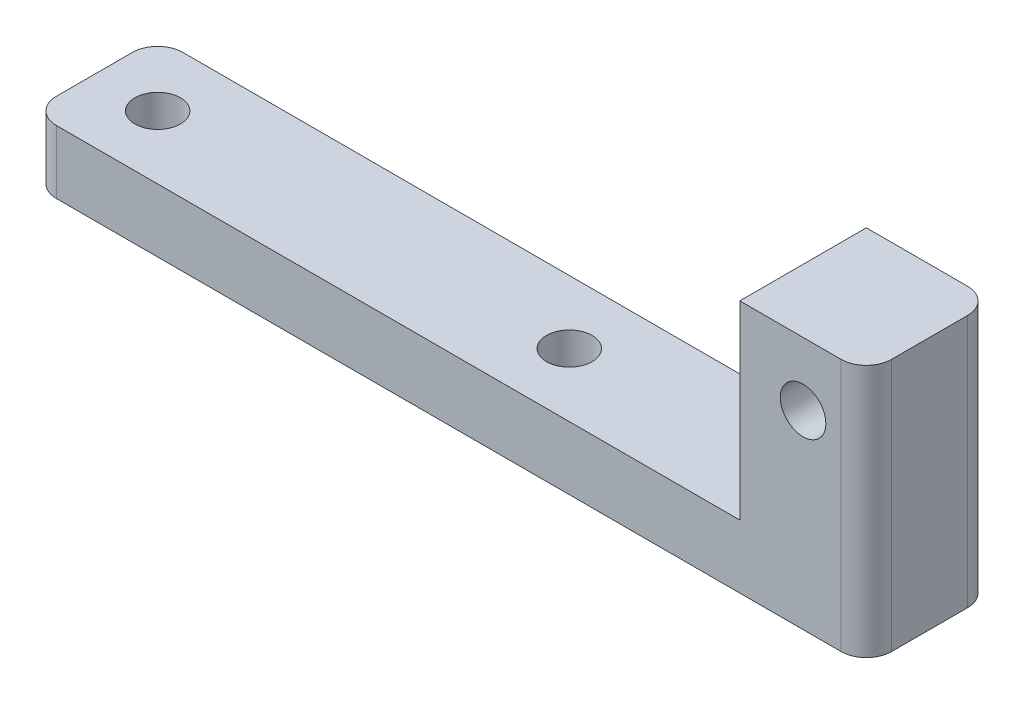
ISO-10303-21;
HEADER;
FILE_DESCRIPTION(('STEP AP214'),'2;1');
FILE_NAME('part.step','',(''),(''),'','','');
FILE_SCHEMA(('AUTOMOTIVE_DESIGN { 1 0 10303 214 1 1 1 1 }'));
ENDSEC;
DATA;
#1=APPLICATION_CONTEXT('core data for automotive mechanical design processes');
#2=APPLICATION_PROTOCOL_DEFINITION('international standard','automotive_design',2000,#1);
#3=PRODUCT_CONTEXT('',#1,'mechanical');
#4=PRODUCT('Part','Part','',(#3));
#5=PRODUCT_RELATED_PRODUCT_CATEGORY('part','',(#4));
#6=PRODUCT_DEFINITION_FORMATION('','',#4);
#7=PRODUCT_DEFINITION_CONTEXT('part definition',#1,'design');
#8=PRODUCT_DEFINITION('design','',#6,#7);
#9=PRODUCT_DEFINITION_SHAPE('','',#8);
#10=(LENGTH_UNIT() NAMED_UNIT(*) SI_UNIT(.MILLI.,.METRE.));
#11=(NAMED_UNIT(*) PLANE_ANGLE_UNIT() SI_UNIT($,.RADIAN.));
#12=(NAMED_UNIT(*) SI_UNIT($,.STERADIAN.) SOLID_ANGLE_UNIT());
#13=UNCERTAINTY_MEASURE_WITH_UNIT(LENGTH_MEASURE(1.E-05),#10,'distance_accuracy_value','');
#14=(GEOMETRIC_REPRESENTATION_CONTEXT(3) GLOBAL_UNCERTAINTY_ASSIGNED_CONTEXT((#13)) GLOBAL_UNIT_ASSIGNED_CONTEXT((#10,
#11,#12)) REPRESENTATION_CONTEXT('',''));
#15=CARTESIAN_POINT('',(0.,0.,0.));
#16=DIRECTION('',(0.,0.,1.));
#17=DIRECTION('',(1.,0.,0.));
#18=AXIS2_PLACEMENT_3D('',#15,#16,#17);
#19=CARTESIAN_POINT('',(0.,25.4,0.));
#20=DIRECTION('',(0.,-1.,0.));
#21=DIRECTION('',(0.,0.,-1.));
#22=AXIS2_PLACEMENT_3D('',#19,#20,#21);
#23=PLANE('',#22);
#24=DIRECTION('',(-1.,0.,0.));
#25=VECTOR('',#24,1.);
#26=CARTESIAN_POINT('',(0.,25.4,-12.7));
#27=LINE('',#26,#25);
#28=CARTESIAN_POINT('',(81.28,25.4,-12.7));
#29=VERTEX_POINT('',#28);
#30=CARTESIAN_POINT('',(71.12,25.4,-12.7));
#31=VERTEX_POINT('',#30);
#32=EDGE_CURVE('E192',#29,#31,#27,.T.);
#33=ORIENTED_EDGE('',*,*,#32,.T.);
#34=DIRECTION('',(0.,0.,1.));
#35=VECTOR('',#34,1.);
#36=CARTESIAN_POINT('',(71.12,25.4,-12.7));
#37=LINE('',#36,#35);
#38=CARTESIAN_POINT('',(71.12,25.4,0.));
#39=VERTEX_POINT('',#38);
#40=EDGE_CURVE('E130',#31,#39,#37,.T.);
#41=ORIENTED_EDGE('',*,*,#40,.T.);
#42=DIRECTION('',(1.,0.,0.));
#43=VECTOR('',#42,1.);
#44=CARTESIAN_POINT('',(0.,25.4,0.));
#45=LINE('',#44,#43);
#46=CARTESIAN_POINT('',(81.28,25.4,0.));
#47=VERTEX_POINT('',#46);
#48=EDGE_CURVE('E66',#39,#47,#45,.T.);
#49=ORIENTED_EDGE('',*,*,#48,.T.);
#50=CARTESIAN_POINT('',(81.28,25.4,-2.54));
#51=DIRECTION('',(0.,-1.,0.));
#52=DIRECTION('',(0.,0.,-1.));
#53=AXIS2_PLACEMENT_3D('',#50,#51,#52);
#54=CIRCLE('',#53,2.54);
#55=CARTESIAN_POINT('',(83.82,25.4,-2.54));
#56=VERTEX_POINT('',#55);
#57=EDGE_CURVE('E233',#47,#56,#54,.F.);
#58=ORIENTED_EDGE('',*,*,#57,.T.);
#59=DIRECTION('',(0.,0.,-1.));
#60=VECTOR('',#59,1.);
#61=CARTESIAN_POINT('',(83.82,25.4,0.));
#62=LINE('',#61,#60);
#63=CARTESIAN_POINT('',(83.82,25.4,-10.16));
#64=VERTEX_POINT('',#63);
#65=EDGE_CURVE('E187',#56,#64,#62,.T.);
#66=ORIENTED_EDGE('',*,*,#65,.T.);
#67=CARTESIAN_POINT('',(81.28,25.4,-10.16));
#68=DIRECTION('',(0.,-1.,0.));
#69=DIRECTION('',(0.,0.,-1.));
#70=AXIS2_PLACEMENT_3D('',#67,#68,#69);
#71=CIRCLE('',#70,2.54);
#72=EDGE_CURVE('E236',#64,#29,#71,.F.);
#73=ORIENTED_EDGE('',*,*,#72,.T.);
#74=EDGE_LOOP('',(#33,#41,#49,#58,#66,#73));
#75=FACE_BOUND('',#74,.T.);
#76=ADVANCED_FACE('F43',(#75),#23,.F.);
#77=CARTESIAN_POINT('',(0.,0.,0.));
#78=DIRECTION('',(0.,-1.,0.));
#79=DIRECTION('',(0.,0.,-1.));
#80=AXIS2_PLACEMENT_3D('',#77,#78,#79);
#81=PLANE('',#80);
#82=CARTESIAN_POINT('',(6.35,0.,-6.35));
#83=DIRECTION('',(0.,1.,0.));
#84=DIRECTION('',(0.,0.,1.));
#85=AXIS2_PLACEMENT_3D('',#82,#83,#84);
#86=CIRCLE('',#85,2.286);
#87=CARTESIAN_POINT('',(6.35,0.,-8.636));
#88=VERTEX_POINT('',#87);
#89=EDGE_CURVE('E180',#88,#88,#86,.T.);
#90=ORIENTED_EDGE('',*,*,#89,.T.);
#91=EDGE_LOOP('',(#90));
#92=FACE_BOUND('',#91,.T.);
#93=DIRECTION('',(-1.,0.,0.));
#94=VECTOR('',#93,1.);
#95=CARTESIAN_POINT('',(0.,0.,-12.7));
#96=LINE('',#95,#94);
#97=CARTESIAN_POINT('',(81.28,0.,-12.7));
#98=VERTEX_POINT('',#97);
#99=CARTESIAN_POINT('',(2.54,0.,-12.7));
#100=VERTEX_POINT('',#99);
#101=EDGE_CURVE('E188',#98,#100,#96,.T.);
#102=ORIENTED_EDGE('',*,*,#101,.F.);
#103=CARTESIAN_POINT('',(81.28,0.,-10.16));
#104=DIRECTION('',(0.,-1.,0.));
#105=DIRECTION('',(0.,0.,-1.));
#106=AXIS2_PLACEMENT_3D('',#103,#104,#105);
#107=CIRCLE('',#106,2.54);
#108=CARTESIAN_POINT('',(83.82,0.,-10.16));
#109=VERTEX_POINT('',#108);
#110=EDGE_CURVE('E223',#98,#109,#107,.T.);
#111=ORIENTED_EDGE('',*,*,#110,.T.);
#112=DIRECTION('',(0.,0.,-1.));
#113=VECTOR('',#112,1.);
#114=CARTESIAN_POINT('',(83.82,0.,0.));
#115=LINE('',#114,#113);
#116=CARTESIAN_POINT('',(83.82,0.,-2.54));
#117=VERTEX_POINT('',#116);
#118=EDGE_CURVE('E202',#117,#109,#115,.T.);
#119=ORIENTED_EDGE('',*,*,#118,.F.);
#120=CARTESIAN_POINT('',(81.28,0.,-2.54));
#121=DIRECTION('',(0.,-1.,0.));
#122=DIRECTION('',(0.,0.,-1.));
#123=AXIS2_PLACEMENT_3D('',#120,#121,#122);
#124=CIRCLE('',#123,2.54);
#125=CARTESIAN_POINT('',(81.28,0.,0.));
#126=VERTEX_POINT('',#125);
#127=EDGE_CURVE('E220',#117,#126,#124,.T.);
#128=ORIENTED_EDGE('',*,*,#127,.T.);
#129=DIRECTION('',(1.,0.,0.));
#130=VECTOR('',#129,1.);
#131=CARTESIAN_POINT('',(0.,0.,0.));
#132=LINE('',#131,#130);
#133=CARTESIAN_POINT('',(2.54,0.,0.));
#134=VERTEX_POINT('',#133);
#135=EDGE_CURVE('E198',#134,#126,#132,.T.);
#136=ORIENTED_EDGE('',*,*,#135,.F.);
#137=CARTESIAN_POINT('',(2.54,0.,-2.54));
#138=DIRECTION('',(0.,-1.,0.));
#139=DIRECTION('',(0.,0.,-1.));
#140=AXIS2_PLACEMENT_3D('',#137,#138,#139);
#141=CIRCLE('',#140,2.54);
#142=CARTESIAN_POINT('',(0.,0.,-2.54));
#143=VERTEX_POINT('',#142);
#144=EDGE_CURVE('E214',#134,#143,#141,.T.);
#145=ORIENTED_EDGE('',*,*,#144,.T.);
#146=DIRECTION('',(0.,0.,1.));
#147=VECTOR('',#146,1.);
#148=CARTESIAN_POINT('',(0.,0.,0.));
#149=LINE('',#148,#147);
#150=CARTESIAN_POINT('',(0.,0.,-10.16));
#151=VERTEX_POINT('',#150);
#152=EDGE_CURVE('E184',#151,#143,#149,.T.);
#153=ORIENTED_EDGE('',*,*,#152,.F.);
#154=CARTESIAN_POINT('',(2.54,0.,-10.16));
#155=DIRECTION('',(0.,-1.,0.));
#156=DIRECTION('',(0.,0.,-1.));
#157=AXIS2_PLACEMENT_3D('',#154,#155,#156);
#158=CIRCLE('',#157,2.54);
#159=EDGE_CURVE('E217',#151,#100,#158,.T.);
#160=ORIENTED_EDGE('',*,*,#159,.T.);
#161=EDGE_LOOP('',(#102,#111,#119,#128,#136,#145,#153,#160));
#162=FACE_BOUND('',#161,.T.);
#163=CARTESIAN_POINT('',(47.6591781569182,0.,-6.35));
#164=DIRECTION('',(0.,1.,0.));
#165=DIRECTION('',(0.,0.,1.));
#166=AXIS2_PLACEMENT_3D('',#163,#164,#165);
#167=CIRCLE('',#166,2.28599999999999);
#168=CARTESIAN_POINT('',(47.6591781569182,0.,-8.63599999999999));
#169=VERTEX_POINT('',#168);
#170=EDGE_CURVE('E173',#169,#169,#167,.T.);
#171=ORIENTED_EDGE('',*,*,#170,.T.);
#172=EDGE_LOOP('',(#171));
#173=FACE_BOUND('',#172,.T.);
#174=ADVANCED_FACE('F259',(#92,#162,#173),#81,.T.);
#175=CARTESIAN_POINT('',(0.,25.4,0.));
#176=DIRECTION('',(1.,0.,0.));
#177=DIRECTION('',(0.,0.,-1.));
#178=AXIS2_PLACEMENT_3D('',#175,#176,#177);
#179=PLANE('',#178);
#180=DIRECTION('',(0.,-1.,0.));
#181=VECTOR('',#180,1.);
#182=CARTESIAN_POINT('',(0.,25.4,-2.54));
#183=LINE('',#182,#181);
#184=CARTESIAN_POINT('',(0.,6.35,-2.54));
#185=VERTEX_POINT('',#184);
#186=EDGE_CURVE('E245',#143,#185,#183,.F.);
#187=ORIENTED_EDGE('',*,*,#186,.T.);
#188=DIRECTION('',(0.,0.,1.));
#189=VECTOR('',#188,1.);
#190=CARTESIAN_POINT('',(0.,6.35,-12.7));
#191=LINE('',#190,#189);
#192=CARTESIAN_POINT('',(0.,6.35,-10.16));
#193=VERTEX_POINT('',#192);
#194=EDGE_CURVE('E58',#193,#185,#191,.T.);
#195=ORIENTED_EDGE('',*,*,#194,.F.);
#196=DIRECTION('',(0.,-1.,0.));
#197=VECTOR('',#196,1.);
#198=CARTESIAN_POINT('',(0.,25.4,-10.16));
#199=LINE('',#198,#197);
#200=EDGE_CURVE('E52',#193,#151,#199,.T.);
#201=ORIENTED_EDGE('',*,*,#200,.T.);
#202=ORIENTED_EDGE('',*,*,#152,.T.);
#203=EDGE_LOOP('',(#187,#195,#201,#202));
#204=FACE_BOUND('',#203,.T.);
#205=ADVANCED_FACE('F252',(#204),#179,.F.);
#206=CARTESIAN_POINT('',(0.,25.4,0.));
#207=DIRECTION('',(0.,0.,-1.));
#208=DIRECTION('',(-1.,0.,0.));
#209=AXIS2_PLACEMENT_3D('',#206,#207,#208);
#210=PLANE('',#209);
#211=CARTESIAN_POINT('',(77.47,19.05,0.));
#212=DIRECTION('',(0.,0.,1.));
#213=DIRECTION('',(1.,0.,0.));
#214=AXIS2_PLACEMENT_3D('',#211,#212,#213);
#215=CIRCLE('',#214,2.28599999999999);
#216=CARTESIAN_POINT('',(79.756,19.05,0.));
#217=VERTEX_POINT('',#216);
#218=EDGE_CURVE('E168',#217,#217,#215,.T.);
#219=ORIENTED_EDGE('',*,*,#218,.F.);
#220=EDGE_LOOP('',(#219));
#221=FACE_BOUND('',#220,.T.);
#222=ORIENTED_EDGE('',*,*,#48,.F.);
#223=DIRECTION('',(0.,1.,0.));
#224=VECTOR('',#223,1.);
#225=CARTESIAN_POINT('',(71.12,25.4,0.));
#226=LINE('',#225,#224);
#227=CARTESIAN_POINT('',(71.12,6.35,0.));
#228=VERTEX_POINT('',#227);
#229=EDGE_CURVE('E146',#228,#39,#226,.T.);
#230=ORIENTED_EDGE('',*,*,#229,.F.);
#231=DIRECTION('',(1.,0.,0.));
#232=VECTOR('',#231,1.);
#233=CARTESIAN_POINT('',(0.,6.35,0.));
#234=LINE('',#233,#232);
#235=CARTESIAN_POINT('',(2.54,6.35,0.));
#236=VERTEX_POINT('',#235);
#237=EDGE_CURVE('E126',#236,#228,#234,.T.);
#238=ORIENTED_EDGE('',*,*,#237,.F.);
#239=DIRECTION('',(0.,-1.,0.));
#240=VECTOR('',#239,1.);
#241=CARTESIAN_POINT('',(2.54,25.4,0.));
#242=LINE('',#241,#240);
#243=EDGE_CURVE('E239',#236,#134,#242,.T.);
#244=ORIENTED_EDGE('',*,*,#243,.T.);
#245=ORIENTED_EDGE('',*,*,#135,.T.);
#246=DIRECTION('',(0.,-1.,0.));
#247=VECTOR('',#246,1.);
#248=CARTESIAN_POINT('',(81.28,25.4,0.));
#249=LINE('',#248,#247);
#250=EDGE_CURVE('E242',#126,#47,#249,.F.);
#251=ORIENTED_EDGE('',*,*,#250,.T.);
#252=EDGE_LOOP('',(#222,#230,#238,#244,#245,#251));
#253=FACE_BOUND('',#252,.T.);
#254=ADVANCED_FACE('F266',(#221,#253),#210,.F.);
#255=CARTESIAN_POINT('',(83.82,25.4,0.));
#256=DIRECTION('',(-1.,0.,0.));
#257=DIRECTION('',(0.,0.,1.));
#258=AXIS2_PLACEMENT_3D('',#255,#256,#257);
#259=PLANE('',#258);
#260=ORIENTED_EDGE('',*,*,#118,.T.);
#261=DIRECTION('',(0.,-1.,0.));
#262=VECTOR('',#261,1.);
#263=CARTESIAN_POINT('',(83.82,25.4,-10.16));
#264=LINE('',#263,#262);
#265=EDGE_CURVE('E230',#109,#64,#264,.F.);
#266=ORIENTED_EDGE('',*,*,#265,.T.);
#267=ORIENTED_EDGE('',*,*,#65,.F.);
#268=DIRECTION('',(0.,-1.,0.));
#269=VECTOR('',#268,1.);
#270=CARTESIAN_POINT('',(83.82,25.4,-2.54));
#271=LINE('',#270,#269);
#272=EDGE_CURVE('E226',#56,#117,#271,.T.);
#273=ORIENTED_EDGE('',*,*,#272,.T.);
#274=EDGE_LOOP('',(#260,#266,#267,#273));
#275=FACE_BOUND('',#274,.T.);
#276=ADVANCED_FACE('F274',(#275),#259,.F.);
#277=CARTESIAN_POINT('',(0.,25.4,-12.7));
#278=DIRECTION('',(0.,0.,1.));
#279=DIRECTION('',(1.,0.,0.));
#280=AXIS2_PLACEMENT_3D('',#277,#278,#279);
#281=PLANE('',#280);
#282=CARTESIAN_POINT('',(77.47,19.05,-12.7));
#283=DIRECTION('',(0.,0.,1.));
#284=DIRECTION('',(1.,0.,0.));
#285=AXIS2_PLACEMENT_3D('',#282,#283,#284);
#286=CIRCLE('',#285,2.28599999999999);
#287=CARTESIAN_POINT('',(79.756,19.05,-12.7));
#288=VERTEX_POINT('',#287);
#289=EDGE_CURVE('E169',#288,#288,#286,.T.);
#290=ORIENTED_EDGE('',*,*,#289,.T.);
#291=EDGE_LOOP('',(#290));
#292=FACE_BOUND('',#291,.T.);
#293=DIRECTION('',(1.,0.,0.));
#294=VECTOR('',#293,1.);
#295=CARTESIAN_POINT('',(0.,6.35,-12.7));
#296=LINE('',#295,#294);
#297=CARTESIAN_POINT('',(2.54,6.35,-12.7));
#298=VERTEX_POINT('',#297);
#299=CARTESIAN_POINT('',(71.12,6.35,-12.7));
#300=VERTEX_POINT('',#299);
#301=EDGE_CURVE('E123',#298,#300,#296,.T.);
#302=ORIENTED_EDGE('',*,*,#301,.T.);
#303=DIRECTION('',(0.,1.,0.));
#304=VECTOR('',#303,1.);
#305=CARTESIAN_POINT('',(71.12,25.4,-12.7));
#306=LINE('',#305,#304);
#307=EDGE_CURVE('E133',#300,#31,#306,.T.);
#308=ORIENTED_EDGE('',*,*,#307,.T.);
#309=ORIENTED_EDGE('',*,*,#32,.F.);
#310=DIRECTION('',(0.,-1.,0.));
#311=VECTOR('',#310,1.);
#312=CARTESIAN_POINT('',(81.28,25.4,-12.7));
#313=LINE('',#312,#311);
#314=EDGE_CURVE('E210',#29,#98,#313,.T.);
#315=ORIENTED_EDGE('',*,*,#314,.T.);
#316=ORIENTED_EDGE('',*,*,#101,.T.);
#317=DIRECTION('',(0.,-1.,0.));
#318=VECTOR('',#317,1.);
#319=CARTESIAN_POINT('',(2.54,25.4,-12.7));
#320=LINE('',#319,#318);
#321=EDGE_CURVE('E144',#100,#298,#320,.F.);
#322=ORIENTED_EDGE('',*,*,#321,.T.);
#323=EDGE_LOOP('',(#302,#308,#309,#315,#316,#322));
#324=FACE_BOUND('',#323,.T.);
#325=ADVANCED_FACE('F141',(#292,#324),#281,.F.);
#326=CARTESIAN_POINT('',(6.35,25.4,-6.35));
#327=DIRECTION('',(0.,-1.,0.));
#328=DIRECTION('',(0.,0.,-1.));
#329=AXIS2_PLACEMENT_3D('',#326,#327,#328);
#330=CYLINDRICAL_SURFACE('',#329,2.286);
#331=CARTESIAN_POINT('',(6.35,6.35,-6.35));
#332=DIRECTION('',(0.,-1.,0.));
#333=DIRECTION('',(1.,0.,0.));
#334=AXIS2_PLACEMENT_3D('',#331,#332,#333);
#335=CIRCLE('',#334,2.286);
#336=CARTESIAN_POINT('',(6.35,6.35,-8.636));
#337=VERTEX_POINT('',#336);
#338=EDGE_CURVE('E164',#337,#337,#335,.T.);
#339=CARTESIAN_POINT('',(6.35,6.35,-8.636));
#340=CARTESIAN_POINT('',(6.35,6.28385416666667,-8.636));
#341=CARTESIAN_POINT('',(6.35,6.21770833333334,-8.636));
#342=CARTESIAN_POINT('',(6.35,6.08541666666667,-8.636));
#343=CARTESIAN_POINT('',(6.35,6.01927083333333,-8.636));
#344=CARTESIAN_POINT('',(6.35,5.88697916666667,-8.636));
#345=CARTESIAN_POINT('',(6.35,5.82083333333333,-8.636));
#346=CARTESIAN_POINT('',(6.35,5.68854166666667,-8.636));
#347=CARTESIAN_POINT('',(6.35,5.62239583333333,-8.636));
#348=CARTESIAN_POINT('',(6.35,5.49010416666667,-8.636));
#349=CARTESIAN_POINT('',(6.35,5.42395833333333,-8.636));
#350=CARTESIAN_POINT('',(6.35,5.29166666666667,-8.636));
#351=CARTESIAN_POINT('',(6.35,5.22552083333333,-8.636));
#352=CARTESIAN_POINT('',(6.35,5.09322916666667,-8.636));
#353=CARTESIAN_POINT('',(6.35,5.02708333333333,-8.636));
#354=CARTESIAN_POINT('',(6.35,4.89479166666667,-8.636));
#355=CARTESIAN_POINT('',(6.35,4.82864583333334,-8.636));
#356=CARTESIAN_POINT('',(6.35,4.69635416666667,-8.636));
#357=CARTESIAN_POINT('',(6.35,4.63020833333333,-8.636));
#358=CARTESIAN_POINT('',(6.35,4.49791666666667,-8.636));
#359=CARTESIAN_POINT('',(6.35,4.43177083333333,-8.636));
#360=CARTESIAN_POINT('',(6.35,4.29947916666667,-8.636));
#361=CARTESIAN_POINT('',(6.35,4.23333333333334,-8.636));
#362=CARTESIAN_POINT('',(6.35,4.10104166666667,-8.636));
#363=CARTESIAN_POINT('',(6.35,4.03489583333333,-8.636));
#364=CARTESIAN_POINT('',(6.35,3.90260416666667,-8.636));
#365=CARTESIAN_POINT('',(6.35,3.83645833333333,-8.636));
#366=CARTESIAN_POINT('',(6.35,3.70416666666667,-8.636));
#367=CARTESIAN_POINT('',(6.35,3.63802083333334,-8.636));
#368=CARTESIAN_POINT('',(6.35,3.50572916666667,-8.636));
#369=CARTESIAN_POINT('',(6.35,3.43958333333333,-8.636));
#370=CARTESIAN_POINT('',(6.35,3.30729166666667,-8.636));
#371=CARTESIAN_POINT('',(6.35,3.24114583333333,-8.636));
#372=CARTESIAN_POINT('',(6.35,3.10885416666667,-8.636));
#373=CARTESIAN_POINT('',(6.35,3.04270833333333,-8.636));
#374=CARTESIAN_POINT('',(6.35,2.91041666666667,-8.636));
#375=CARTESIAN_POINT('',(6.35,2.84427083333333,-8.636));
#376=CARTESIAN_POINT('',(6.35,2.71197916666667,-8.636));
#377=CARTESIAN_POINT('',(6.35,2.64583333333333,-8.636));
#378=CARTESIAN_POINT('',(6.35,2.51354166666667,-8.636));
#379=CARTESIAN_POINT('',(6.35,2.44739583333333,-8.636));
#380=CARTESIAN_POINT('',(6.35,2.31510416666667,-8.636));
#381=CARTESIAN_POINT('',(6.35,2.24895833333333,-8.636));
#382=CARTESIAN_POINT('',(6.35,2.11666666666667,-8.636));
#383=CARTESIAN_POINT('',(6.35,2.05052083333333,-8.636));
#384=CARTESIAN_POINT('',(6.35,1.91822916666667,-8.636));
#385=CARTESIAN_POINT('',(6.35,1.85208333333333,-8.636));
#386=CARTESIAN_POINT('',(6.35,1.71979166666667,-8.636));
#387=CARTESIAN_POINT('',(6.35,1.65364583333333,-8.636));
#388=CARTESIAN_POINT('',(6.35,1.52135416666667,-8.636));
#389=CARTESIAN_POINT('',(6.35,1.45520833333333,-8.636));
#390=CARTESIAN_POINT('',(6.35,1.32291666666667,-8.636));
#391=CARTESIAN_POINT('',(6.35,1.25677083333333,-8.636));
#392=CARTESIAN_POINT('',(6.35,1.12447916666667,-8.636));
#393=CARTESIAN_POINT('',(6.35,1.05833333333333,-8.636));
#394=CARTESIAN_POINT('',(6.35,0.926041666666665,-8.636));
#395=CARTESIAN_POINT('',(6.35,0.859895833333332,-8.636));
#396=CARTESIAN_POINT('',(6.35,0.727604166666666,-8.636));
#397=CARTESIAN_POINT('',(6.35,0.661458333333333,-8.636));
#398=CARTESIAN_POINT('',(6.35,0.529166666666666,-8.636));
#399=CARTESIAN_POINT('',(6.35,0.463020833333332,-8.636));
#400=CARTESIAN_POINT('',(6.35,0.330729166666665,-8.636));
#401=CARTESIAN_POINT('',(6.35,0.264583333333332,-8.636));
#402=CARTESIAN_POINT('',(6.35,0.132291666666666,-8.636));
#403=CARTESIAN_POINT('',(6.35,0.066145833333333,-8.636));
#404=CARTESIAN_POINT('',(6.35,0.,-8.636));
#405=B_SPLINE_CURVE_WITH_KNOTS('',3,(#339,#340,#341,#342,#343,#344,#345,#346,#347,#348,#349,
#350,#351,#352,#353,#354,#355,#356,#357,#358,#359,#360,#361,#362,#363,#364,#365,#366,#367,#368,
#369,#370,#371,#372,#373,#374,#375,#376,#377,#378,#379,#380,#381,#382,#383,#384,#385,#386,#387,
#388,#389,#390,#391,#392,#393,#394,#395,#396,#397,#398,#399,#400,#401,#402,#403,#404),
.UNSPECIFIED.,.F.,.F.,(4,2,2,2,2,2,2,2,2,2,2,2,2,2,2,2,2,2,2,2,2,2,2,2,2,2,2,2,2,2,2,2,4),(0.,
0.198437499999999,0.396875000000001,0.5953125,0.793749999999999,0.992187500000002,1.190625,
1.3890625,1.5875,1.7859375,1.984375,2.1828125,2.38125,2.5796875,2.778125,2.9765625,3.175,
3.3734375,3.571875,3.7703125,3.96875,4.1671875,4.365625,4.5640625,4.7625,4.9609375,5.159375,
5.3578125,5.55625,5.7546875,5.953125,6.1515625,6.35),.UNSPECIFIED.);
#406=EDGE_CURVE('BSEAM297',#337,#88,#405,.T.);
#407=ORIENTED_EDGE('',*,*,#338,.F.);
#408=ORIENTED_EDGE('',*,*,#89,.F.);
#409=ORIENTED_EDGE('',*,*,#406,.T.);
#410=ORIENTED_EDGE('',*,*,#406,.F.);
#411=EDGE_LOOP('',(#407,#409,#408,#410));
#412=FACE_BOUND('',#411,.T.);
#413=ADVANCED_FACE('F297',(#412),#330,.F.);
#414=CARTESIAN_POINT('',(47.6591781569182,25.4,-6.35));
#415=DIRECTION('',(0.,-1.,0.));
#416=DIRECTION('',(0.,0.,-1.));
#417=AXIS2_PLACEMENT_3D('',#414,#415,#416);
#418=CYLINDRICAL_SURFACE('',#417,2.28599999999999);
#419=CARTESIAN_POINT('',(47.6591781569182,6.35,-6.35));
#420=DIRECTION('',(0.,-1.,0.));
#421=DIRECTION('',(1.,0.,0.));
#422=AXIS2_PLACEMENT_3D('',#419,#420,#421);
#423=CIRCLE('',#422,2.28599999999999);
#424=CARTESIAN_POINT('',(47.6591781569182,6.35,-8.63599999999999));
#425=VERTEX_POINT('',#424);
#426=EDGE_CURVE('E160',#425,#425,#423,.T.);
#427=CARTESIAN_POINT('',(47.6591781569182,6.35,-8.63599999999999));
#428=CARTESIAN_POINT('',(47.6591781569182,6.28385416666667,-8.63599999999999));
#429=CARTESIAN_POINT('',(47.6591781569182,6.21770833333334,-8.63599999999999));
#430=CARTESIAN_POINT('',(47.6591781569182,6.08541666666667,-8.63599999999999));
#431=CARTESIAN_POINT('',(47.6591781569182,6.01927083333333,-8.63599999999999));
#432=CARTESIAN_POINT('',(47.6591781569182,5.88697916666667,-8.63599999999999));
#433=CARTESIAN_POINT('',(47.6591781569182,5.82083333333333,-8.63599999999999));
#434=CARTESIAN_POINT('',(47.6591781569182,5.68854166666667,-8.63599999999999));
#435=CARTESIAN_POINT('',(47.6591781569182,5.62239583333333,-8.63599999999999));
#436=CARTESIAN_POINT('',(47.6591781569182,5.49010416666667,-8.63599999999999));
#437=CARTESIAN_POINT('',(47.6591781569182,5.42395833333333,-8.63599999999999));
#438=CARTESIAN_POINT('',(47.6591781569182,5.29166666666667,-8.63599999999999));
#439=CARTESIAN_POINT('',(47.6591781569182,5.22552083333333,-8.63599999999999));
#440=CARTESIAN_POINT('',(47.6591781569182,5.09322916666667,-8.63599999999999));
#441=CARTESIAN_POINT('',(47.6591781569182,5.02708333333333,-8.63599999999999));
#442=CARTESIAN_POINT('',(47.6591781569182,4.89479166666667,-8.63599999999999));
#443=CARTESIAN_POINT('',(47.6591781569182,4.82864583333334,-8.63599999999999));
#444=CARTESIAN_POINT('',(47.6591781569182,4.69635416666667,-8.63599999999999));
#445=CARTESIAN_POINT('',(47.6591781569182,4.63020833333333,-8.63599999999999));
#446=CARTESIAN_POINT('',(47.6591781569182,4.49791666666667,-8.63599999999999));
#447=CARTESIAN_POINT('',(47.6591781569182,4.43177083333333,-8.63599999999999));
#448=CARTESIAN_POINT('',(47.6591781569182,4.29947916666667,-8.63599999999999));
#449=CARTESIAN_POINT('',(47.6591781569182,4.23333333333334,-8.63599999999999));
#450=CARTESIAN_POINT('',(47.6591781569182,4.10104166666667,-8.63599999999999));
#451=CARTESIAN_POINT('',(47.6591781569182,4.03489583333333,-8.63599999999999));
#452=CARTESIAN_POINT('',(47.6591781569182,3.90260416666667,-8.63599999999999));
#453=CARTESIAN_POINT('',(47.6591781569182,3.83645833333333,-8.63599999999999));
#454=CARTESIAN_POINT('',(47.6591781569182,3.70416666666667,-8.63599999999999));
#455=CARTESIAN_POINT('',(47.6591781569182,3.63802083333334,-8.63599999999999));
#456=CARTESIAN_POINT('',(47.6591781569182,3.50572916666667,-8.63599999999999));
#457=CARTESIAN_POINT('',(47.6591781569182,3.43958333333333,-8.63599999999999));
#458=CARTESIAN_POINT('',(47.6591781569182,3.30729166666667,-8.63599999999999));
#459=CARTESIAN_POINT('',(47.6591781569182,3.24114583333333,-8.63599999999999));
#460=CARTESIAN_POINT('',(47.6591781569182,3.10885416666667,-8.63599999999999));
#461=CARTESIAN_POINT('',(47.6591781569182,3.04270833333333,-8.63599999999999));
#462=CARTESIAN_POINT('',(47.6591781569182,2.91041666666667,-8.63599999999999));
#463=CARTESIAN_POINT('',(47.6591781569182,2.84427083333333,-8.63599999999999));
#464=CARTESIAN_POINT('',(47.6591781569182,2.71197916666667,-8.63599999999999));
#465=CARTESIAN_POINT('',(47.6591781569182,2.64583333333333,-8.63599999999999));
#466=CARTESIAN_POINT('',(47.6591781569182,2.51354166666667,-8.63599999999999));
#467=CARTESIAN_POINT('',(47.6591781569182,2.44739583333333,-8.63599999999999));
#468=CARTESIAN_POINT('',(47.6591781569182,2.31510416666667,-8.63599999999999));
#469=CARTESIAN_POINT('',(47.6591781569182,2.24895833333333,-8.63599999999999));
#470=CARTESIAN_POINT('',(47.6591781569182,2.11666666666667,-8.63599999999999));
#471=CARTESIAN_POINT('',(47.6591781569182,2.05052083333333,-8.63599999999999));
#472=CARTESIAN_POINT('',(47.6591781569182,1.91822916666667,-8.63599999999999));
#473=CARTESIAN_POINT('',(47.6591781569182,1.85208333333333,-8.63599999999999));
#474=CARTESIAN_POINT('',(47.6591781569182,1.71979166666667,-8.63599999999999));
#475=CARTESIAN_POINT('',(47.6591781569182,1.65364583333333,-8.63599999999999));
#476=CARTESIAN_POINT('',(47.6591781569182,1.52135416666667,-8.63599999999999));
#477=CARTESIAN_POINT('',(47.6591781569182,1.45520833333333,-8.63599999999999));
#478=CARTESIAN_POINT('',(47.6591781569182,1.32291666666667,-8.63599999999999));
#479=CARTESIAN_POINT('',(47.6591781569182,1.25677083333333,-8.63599999999999));
#480=CARTESIAN_POINT('',(47.6591781569182,1.12447916666667,-8.63599999999999));
#481=CARTESIAN_POINT('',(47.6591781569182,1.05833333333333,-8.63599999999999));
#482=CARTESIAN_POINT('',(47.6591781569182,0.926041666666665,-8.63599999999999));
#483=CARTESIAN_POINT('',(47.6591781569182,0.859895833333332,-8.63599999999999));
#484=CARTESIAN_POINT('',(47.6591781569182,0.727604166666666,-8.63599999999999));
#485=CARTESIAN_POINT('',(47.6591781569182,0.661458333333333,-8.63599999999999));
#486=CARTESIAN_POINT('',(47.6591781569182,0.529166666666666,-8.63599999999999));
#487=CARTESIAN_POINT('',(47.6591781569182,0.463020833333332,-8.63599999999999));
#488=CARTESIAN_POINT('',(47.6591781569182,0.330729166666665,-8.63599999999999));
#489=CARTESIAN_POINT('',(47.6591781569182,0.264583333333332,-8.63599999999999));
#490=CARTESIAN_POINT('',(47.6591781569182,0.132291666666666,-8.63599999999999));
#491=CARTESIAN_POINT('',(47.6591781569182,0.066145833333333,-8.63599999999999));
#492=CARTESIAN_POINT('',(47.6591781569182,0.,-8.63599999999999));
#493=B_SPLINE_CURVE_WITH_KNOTS('',3,(#427,#428,#429,#430,#431,#432,#433,#434,#435,#436,#437,
#438,#439,#440,#441,#442,#443,#444,#445,#446,#447,#448,#449,#450,#451,#452,#453,#454,#455,#456,
#457,#458,#459,#460,#461,#462,#463,#464,#465,#466,#467,#468,#469,#470,#471,#472,#473,#474,#475,
#476,#477,#478,#479,#480,#481,#482,#483,#484,#485,#486,#487,#488,#489,#490,#491,#492),
.UNSPECIFIED.,.F.,.F.,(4,2,2,2,2,2,2,2,2,2,2,2,2,2,2,2,2,2,2,2,2,2,2,2,2,2,2,2,2,2,2,2,4),(0.,
0.198437499999999,0.396875000000001,0.5953125,0.793749999999999,0.992187500000002,1.190625,
1.3890625,1.5875,1.7859375,1.984375,2.1828125,2.38125,2.5796875,2.778125,2.9765625,3.175,
3.3734375,3.571875,3.7703125,3.96875,4.1671875,4.365625,4.5640625,4.7625,4.9609375,5.159375,
5.3578125,5.55625,5.7546875,5.953125,6.1515625,6.35),.UNSPECIFIED.);
#494=EDGE_CURVE('BSEAM332',#425,#169,#493,.T.);
#495=ORIENTED_EDGE('',*,*,#426,.F.);
#496=ORIENTED_EDGE('',*,*,#170,.F.);
#497=ORIENTED_EDGE('',*,*,#494,.T.);
#498=ORIENTED_EDGE('',*,*,#494,.F.);
#499=EDGE_LOOP('',(#495,#497,#496,#498));
#500=FACE_BOUND('',#499,.T.);
#501=ADVANCED_FACE('F332',(#500),#418,.F.);
#502=CARTESIAN_POINT('',(77.47,19.05,-12.7));
#503=DIRECTION('',(0.,0.,1.));
#504=DIRECTION('',(1.,0.,0.));
#505=AXIS2_PLACEMENT_3D('',#502,#503,#504);
#506=CYLINDRICAL_SURFACE('',#505,2.28599999999999);
#507=CARTESIAN_POINT('',(79.756,19.05,-12.7));
#508=CARTESIAN_POINT('',(79.756,19.05,-12.5677083333333));
#509=CARTESIAN_POINT('',(79.756,19.05,-12.4354166666667));
#510=CARTESIAN_POINT('',(79.756,19.05,-12.1708333333333));
#511=CARTESIAN_POINT('',(79.756,19.05,-12.0385416666667));
#512=CARTESIAN_POINT('',(79.756,19.05,-11.7739583333333));
#513=CARTESIAN_POINT('',(79.756,19.05,-11.6416666666667));
#514=CARTESIAN_POINT('',(79.756,19.05,-11.3770833333333));
#515=CARTESIAN_POINT('',(79.756,19.05,-11.2447916666667));
#516=CARTESIAN_POINT('',(79.756,19.05,-10.9802083333333));
#517=CARTESIAN_POINT('',(79.756,19.05,-10.8479166666667));
#518=CARTESIAN_POINT('',(79.756,19.05,-10.5833333333333));
#519=CARTESIAN_POINT('',(79.756,19.05,-10.4510416666667));
#520=CARTESIAN_POINT('',(79.756,19.05,-10.1864583333333));
#521=CARTESIAN_POINT('',(79.756,19.05,-10.0541666666667));
#522=CARTESIAN_POINT('',(79.756,19.05,-9.78958333333334));
#523=CARTESIAN_POINT('',(79.756,19.05,-9.65729166666667));
#524=CARTESIAN_POINT('',(79.756,19.05,-9.39270833333333));
#525=CARTESIAN_POINT('',(79.756,19.05,-9.26041666666667));
#526=CARTESIAN_POINT('',(79.756,19.05,-8.99583333333334));
#527=CARTESIAN_POINT('',(79.756,19.05,-8.86354166666667));
#528=CARTESIAN_POINT('',(79.756,19.05,-8.59895833333334));
#529=CARTESIAN_POINT('',(79.756,19.05,-8.46666666666667));
#530=CARTESIAN_POINT('',(79.756,19.05,-8.20208333333333));
#531=CARTESIAN_POINT('',(79.756,19.05,-8.06979166666667));
#532=CARTESIAN_POINT('',(79.756,19.05,-7.80520833333333));
#533=CARTESIAN_POINT('',(79.756,19.05,-7.67291666666667));
#534=CARTESIAN_POINT('',(79.756,19.05,-7.40833333333333));
#535=CARTESIAN_POINT('',(79.756,19.05,-7.27604166666667));
#536=CARTESIAN_POINT('',(79.756,19.05,-7.01145833333333));
#537=CARTESIAN_POINT('',(79.756,19.05,-6.87916666666667));
#538=CARTESIAN_POINT('',(79.756,19.05,-6.61458333333333));
#539=CARTESIAN_POINT('',(79.756,19.05,-6.48229166666667));
#540=CARTESIAN_POINT('',(79.756,19.05,-6.21770833333333));
#541=CARTESIAN_POINT('',(79.756,19.05,-6.08541666666667));
#542=CARTESIAN_POINT('',(79.756,19.05,-5.82083333333333));
#543=CARTESIAN_POINT('',(79.756,19.05,-5.68854166666667));
#544=CARTESIAN_POINT('',(79.756,19.05,-5.42395833333333));
#545=CARTESIAN_POINT('',(79.756,19.05,-5.29166666666667));
#546=CARTESIAN_POINT('',(79.756,19.05,-5.02708333333333));
#547=CARTESIAN_POINT('',(79.756,19.05,-4.89479166666667));
#548=CARTESIAN_POINT('',(79.756,19.05,-4.63020833333333));
#549=CARTESIAN_POINT('',(79.756,19.05,-4.49791666666667));
#550=CARTESIAN_POINT('',(79.756,19.05,-4.23333333333333));
#551=CARTESIAN_POINT('',(79.756,19.05,-4.10104166666667));
#552=CARTESIAN_POINT('',(79.756,19.05,-3.83645833333334));
#553=CARTESIAN_POINT('',(79.756,19.05,-3.70416666666667));
#554=CARTESIAN_POINT('',(79.756,19.05,-3.43958333333333));
#555=CARTESIAN_POINT('',(79.756,19.05,-3.30729166666667));
#556=CARTESIAN_POINT('',(79.756,19.05,-3.04270833333333));
#557=CARTESIAN_POINT('',(79.756,19.05,-2.91041666666667));
#558=CARTESIAN_POINT('',(79.756,19.05,-2.64583333333333));
#559=CARTESIAN_POINT('',(79.756,19.05,-2.51354166666667));
#560=CARTESIAN_POINT('',(79.756,19.05,-2.24895833333333));
#561=CARTESIAN_POINT('',(79.756,19.05,-2.11666666666667));
#562=CARTESIAN_POINT('',(79.756,19.05,-1.85208333333333));
#563=CARTESIAN_POINT('',(79.756,19.05,-1.71979166666667));
#564=CARTESIAN_POINT('',(79.756,19.05,-1.45520833333333));
#565=CARTESIAN_POINT('',(79.756,19.05,-1.32291666666667));
#566=CARTESIAN_POINT('',(79.756,19.05,-1.05833333333333));
#567=CARTESIAN_POINT('',(79.756,19.05,-0.926041666666668));
#568=CARTESIAN_POINT('',(79.756,19.05,-0.661458333333334));
#569=CARTESIAN_POINT('',(79.756,19.05,-0.529166666666667));
#570=CARTESIAN_POINT('',(79.756,19.05,-0.264583333333333));
#571=CARTESIAN_POINT('',(79.756,19.05,-0.132291666666667));
#572=CARTESIAN_POINT('',(79.756,19.05,0.));
#573=B_SPLINE_CURVE_WITH_KNOTS('',3,(#507,#508,#509,#510,#511,#512,#513,#514,#515,#516,#517,
#518,#519,#520,#521,#522,#523,#524,#525,#526,#527,#528,#529,#530,#531,#532,#533,#534,#535,#536,
#537,#538,#539,#540,#541,#542,#543,#544,#545,#546,#547,#548,#549,#550,#551,#552,#553,#554,#555,
#556,#557,#558,#559,#560,#561,#562,#563,#564,#565,#566,#567,#568,#569,#570,#571,#572),
.UNSPECIFIED.,.F.,.F.,(4,2,2,2,2,2,2,2,2,2,2,2,2,2,2,2,2,2,2,2,2,2,2,2,2,2,2,2,2,2,2,2,4),(0.,
0.396875000000001,0.793750000000001,1.190625,1.5875,1.984375,2.38125,2.778125,3.175,3.571875,
3.96875,4.365625,4.7625,5.159375,5.55625,5.953125,6.35,6.746875,7.14375,7.540625,7.9375,
8.334375,8.73125,9.128125,9.525,9.921875,10.31875,10.715625,11.1125,11.509375,11.90625,
12.303125,12.7),.UNSPECIFIED.);
#574=EDGE_CURVE('BSEAM287',#288,#217,#573,.T.);
#575=ORIENTED_EDGE('',*,*,#289,.F.);
#576=ORIENTED_EDGE('',*,*,#218,.T.);
#577=ORIENTED_EDGE('',*,*,#574,.T.);
#578=ORIENTED_EDGE('',*,*,#574,.F.);
#579=EDGE_LOOP('',(#575,#577,#576,#578));
#580=FACE_BOUND('',#579,.T.);
#581=ADVANCED_FACE('F287',(#580),#506,.F.);
#582=CARTESIAN_POINT('',(81.28,25.4,-10.16));
#583=DIRECTION('',(0.,-1.,0.));
#584=DIRECTION('',(0.,0.,-1.));
#585=AXIS2_PLACEMENT_3D('',#582,#583,#584);
#586=CYLINDRICAL_SURFACE('',#585,2.54);
#587=ORIENTED_EDGE('',*,*,#72,.F.);
#588=ORIENTED_EDGE('',*,*,#265,.F.);
#589=ORIENTED_EDGE('',*,*,#110,.F.);
#590=ORIENTED_EDGE('',*,*,#314,.F.);
#591=EDGE_LOOP('',(#587,#588,#589,#590));
#592=FACE_BOUND('',#591,.T.);
#593=ADVANCED_FACE('F270',(#592),#586,.T.);
#594=CARTESIAN_POINT('',(81.28,25.4,-2.54));
#595=DIRECTION('',(0.,-1.,0.));
#596=DIRECTION('',(0.,0.,-1.));
#597=AXIS2_PLACEMENT_3D('',#594,#595,#596);
#598=CYLINDRICAL_SURFACE('',#597,2.54);
#599=ORIENTED_EDGE('',*,*,#57,.F.);
#600=ORIENTED_EDGE('',*,*,#250,.F.);
#601=ORIENTED_EDGE('',*,*,#127,.F.);
#602=ORIENTED_EDGE('',*,*,#272,.F.);
#603=EDGE_LOOP('',(#599,#600,#601,#602));
#604=FACE_BOUND('',#603,.T.);
#605=ADVANCED_FACE('F279',(#604),#598,.T.);
#606=CARTESIAN_POINT('',(2.54,25.4,-10.16));
#607=DIRECTION('',(0.,-1.,0.));
#608=DIRECTION('',(0.,0.,-1.));
#609=AXIS2_PLACEMENT_3D('',#606,#607,#608);
#610=CYLINDRICAL_SURFACE('',#609,2.54);
#611=CARTESIAN_POINT('',(2.54,6.35,-10.16));
#612=DIRECTION('',(0.,-1.,0.));
#613=DIRECTION('',(1.,0.,0.));
#614=AXIS2_PLACEMENT_3D('',#611,#612,#613);
#615=CIRCLE('',#614,2.54);
#616=EDGE_CURVE('E154',#298,#193,#615,.F.);
#617=ORIENTED_EDGE('',*,*,#616,.F.);
#618=ORIENTED_EDGE('',*,*,#321,.F.);
#619=ORIENTED_EDGE('',*,*,#159,.F.);
#620=ORIENTED_EDGE('',*,*,#200,.F.);
#621=EDGE_LOOP('',(#617,#618,#619,#620));
#622=FACE_BOUND('',#621,.T.);
#623=ADVANCED_FACE('F256',(#622),#610,.T.);
#624=CARTESIAN_POINT('',(2.54,25.4,-2.54));
#625=DIRECTION('',(0.,-1.,0.));
#626=DIRECTION('',(0.,0.,-1.));
#627=AXIS2_PLACEMENT_3D('',#624,#625,#626);
#628=CYLINDRICAL_SURFACE('',#627,2.54);
#629=CARTESIAN_POINT('',(2.54,6.35,-2.54));
#630=DIRECTION('',(0.,-1.,0.));
#631=DIRECTION('',(1.,0.,0.));
#632=AXIS2_PLACEMENT_3D('',#629,#630,#631);
#633=CIRCLE('',#632,2.54);
#634=EDGE_CURVE('E11',#185,#236,#633,.F.);
#635=ORIENTED_EDGE('',*,*,#634,.F.);
#636=ORIENTED_EDGE('',*,*,#186,.F.);
#637=ORIENTED_EDGE('',*,*,#144,.F.);
#638=ORIENTED_EDGE('',*,*,#243,.F.);
#639=EDGE_LOOP('',(#635,#636,#637,#638));
#640=FACE_BOUND('',#639,.T.);
#641=ADVANCED_FACE('F45',(#640),#628,.T.);
#642=CARTESIAN_POINT('',(71.12,25.4,-12.7));
#643=DIRECTION('',(1.,0.,0.));
#644=DIRECTION('',(0.,0.,-1.));
#645=AXIS2_PLACEMENT_3D('',#642,#643,#644);
#646=PLANE('',#645);
#647=ORIENTED_EDGE('',*,*,#229,.T.);
#648=ORIENTED_EDGE('',*,*,#40,.F.);
#649=ORIENTED_EDGE('',*,*,#307,.F.);
#650=DIRECTION('',(0.,0.,1.));
#651=VECTOR('',#650,1.);
#652=CARTESIAN_POINT('',(71.12,6.35,-12.7));
#653=LINE('',#652,#651);
#654=EDGE_CURVE('E119',#300,#228,#653,.T.);
#655=ORIENTED_EDGE('',*,*,#654,.T.);
#656=EDGE_LOOP('',(#647,#648,#649,#655));
#657=FACE_BOUND('',#656,.T.);
#658=ADVANCED_FACE('F134',(#657),#646,.F.);
#659=CARTESIAN_POINT('',(0.,6.35,-12.7));
#660=DIRECTION('',(0.,-1.,0.));
#661=DIRECTION('',(1.,0.,0.));
#662=AXIS2_PLACEMENT_3D('',#659,#660,#661);
#663=PLANE('',#662);
#664=ORIENTED_EDGE('',*,*,#338,.T.);
#665=EDGE_LOOP('',(#664));
#666=FACE_BOUND('',#665,.T.);
#667=ORIENTED_EDGE('',*,*,#426,.T.);
#668=EDGE_LOOP('',(#667));
#669=FACE_BOUND('',#668,.T.);
#670=ORIENTED_EDGE('',*,*,#616,.T.);
#671=ORIENTED_EDGE('',*,*,#194,.T.);
#672=ORIENTED_EDGE('',*,*,#634,.T.);
#673=ORIENTED_EDGE('',*,*,#237,.T.);
#674=ORIENTED_EDGE('',*,*,#654,.F.);
#675=ORIENTED_EDGE('',*,*,#301,.F.);
#676=EDGE_LOOP('',(#670,#671,#672,#673,#674,#675));
#677=FACE_BOUND('',#676,.T.);
#678=ADVANCED_FACE('F121',(#666,#669,#677),#663,.F.);
#679=CLOSED_SHELL('',(#76,#174,#205,#254,#276,#325,#413,#501,#581,#593,#605,#623,#641,#658,#678));
#680=MANIFOLD_SOLID_BREP('B2',#679);
#681=ADVANCED_BREP_SHAPE_REPRESENTATION('',(#18,#680),#14);
#682=SHAPE_DEFINITION_REPRESENTATION(#9,#681);
ENDSEC;
END-ISO-10303-21;
